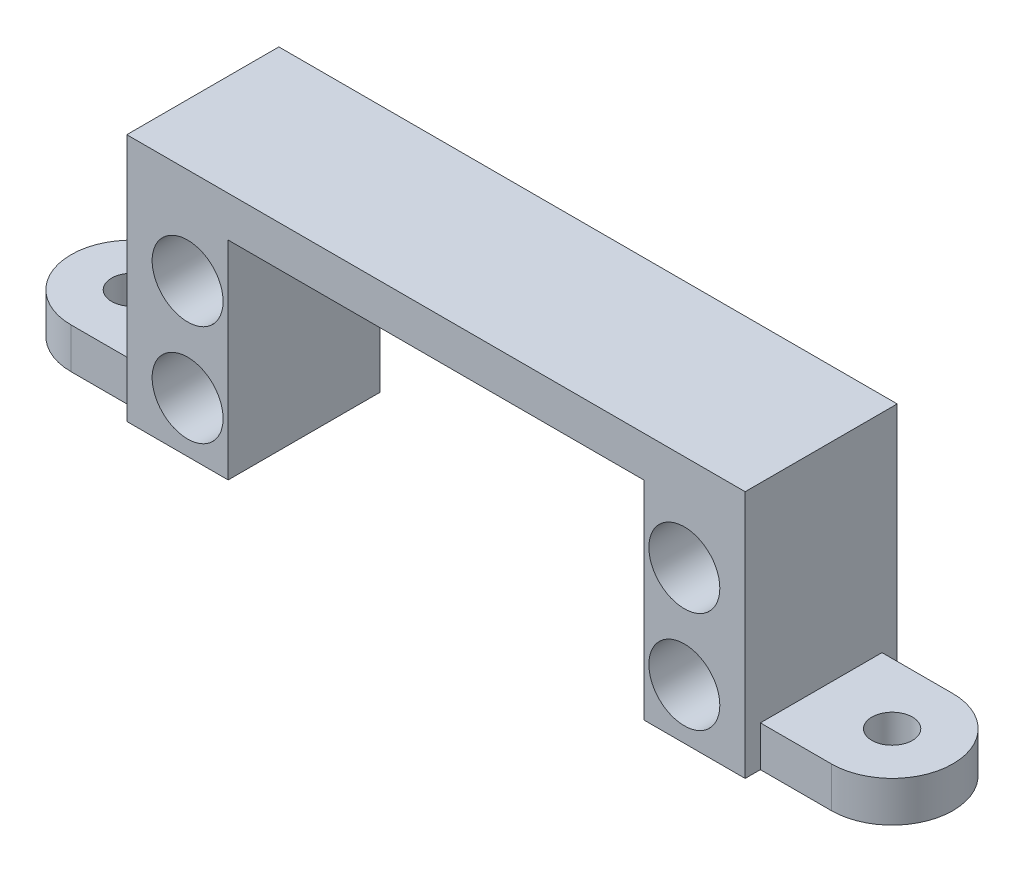
ISO-10303-21;
HEADER;
FILE_DESCRIPTION(('STEP AP214'),'2;1');
FILE_NAME('part.step','',(''),(''),'','','');
FILE_SCHEMA(('AUTOMOTIVE_DESIGN { 1 0 10303 214 1 1 1 1 }'));
ENDSEC;
DATA;
#1=APPLICATION_CONTEXT('core data for automotive mechanical design processes');
#2=APPLICATION_PROTOCOL_DEFINITION('international standard','automotive_design',2000,#1);
#3=PRODUCT_CONTEXT('',#1,'mechanical');
#4=PRODUCT('Part','Part','',(#3));
#5=PRODUCT_RELATED_PRODUCT_CATEGORY('part','',(#4));
#6=PRODUCT_DEFINITION_FORMATION('','',#4);
#7=PRODUCT_DEFINITION_CONTEXT('part definition',#1,'design');
#8=PRODUCT_DEFINITION('design','',#6,#7);
#9=PRODUCT_DEFINITION_SHAPE('','',#8);
#10=(LENGTH_UNIT() NAMED_UNIT(*) SI_UNIT(.MILLI.,.METRE.));
#11=(NAMED_UNIT(*) PLANE_ANGLE_UNIT() SI_UNIT($,.RADIAN.));
#12=(NAMED_UNIT(*) SI_UNIT($,.STERADIAN.) SOLID_ANGLE_UNIT());
#13=UNCERTAINTY_MEASURE_WITH_UNIT(LENGTH_MEASURE(1.E-05),#10,'distance_accuracy_value','');
#14=(GEOMETRIC_REPRESENTATION_CONTEXT(3) GLOBAL_UNCERTAINTY_ASSIGNED_CONTEXT((#13)) GLOBAL_UNIT_ASSIGNED_CONTEXT((#10,
#11,#12)) REPRESENTATION_CONTEXT('',''));
#15=CARTESIAN_POINT('',(0.,0.,0.));
#16=DIRECTION('',(0.,0.,1.));
#17=DIRECTION('',(1.,0.,0.));
#18=AXIS2_PLACEMENT_3D('',#15,#16,#17);
#19=CARTESIAN_POINT('',(-10.,24.5,15.));
#20=DIRECTION('',(1.,0.,0.));
#21=DIRECTION('',(0.,1.,0.));
#22=AXIS2_PLACEMENT_3D('',#19,#20,#21);
#23=PLANE('',#22);
#24=DIRECTION('',(0.,-1.,0.));
#25=VECTOR('',#24,1.);
#26=CARTESIAN_POINT('',(-10.,4.,1.5));
#27=LINE('',#26,#25);
#28=CARTESIAN_POINT('',(-10.,4.,1.5));
#29=VERTEX_POINT('',#28);
#30=CARTESIAN_POINT('',(-10.,0.,1.5));
#31=VERTEX_POINT('',#30);
#32=EDGE_CURVE('E725',#29,#31,#27,.T.);
#33=ORIENTED_EDGE('',*,*,#32,.F.);
#34=DIRECTION('',(0.,0.,-1.));
#35=VECTOR('',#34,1.);
#36=CARTESIAN_POINT('',(-10.,4.,0.));
#37=LINE('',#36,#35);
#38=CARTESIAN_POINT('',(-10.,4.,13.5));
#39=VERTEX_POINT('',#38);
#40=EDGE_CURVE('E216',#39,#29,#37,.T.);
#41=ORIENTED_EDGE('',*,*,#40,.F.);
#42=DIRECTION('',(0.,-1.,0.));
#43=VECTOR('',#42,1.);
#44=CARTESIAN_POINT('',(-10.,4.,13.5));
#45=LINE('',#44,#43);
#46=CARTESIAN_POINT('',(-10.,0.,13.5));
#47=VERTEX_POINT('',#46);
#48=EDGE_CURVE('E193',#39,#47,#45,.T.);
#49=ORIENTED_EDGE('',*,*,#48,.T.);
#50=DIRECTION('',(0.,0.,-1.));
#51=VECTOR('',#50,1.);
#52=CARTESIAN_POINT('',(-10.,0.,15.));
#53=LINE('',#52,#51);
#54=CARTESIAN_POINT('',(-10.,0.,15.));
#55=VERTEX_POINT('',#54);
#56=EDGE_CURVE('E210',#55,#47,#53,.T.);
#57=ORIENTED_EDGE('',*,*,#56,.F.);
#58=DIRECTION('',(0.,-1.,0.));
#59=VECTOR('',#58,1.);
#60=CARTESIAN_POINT('',(-10.,24.5,15.));
#61=LINE('',#60,#59);
#62=CARTESIAN_POINT('',(-10.,24.5,15.));
#63=VERTEX_POINT('',#62);
#64=EDGE_CURVE('E320',#63,#55,#61,.T.);
#65=ORIENTED_EDGE('',*,*,#64,.F.);
#66=DIRECTION('',(0.,0.,-1.));
#67=VECTOR('',#66,1.);
#68=CARTESIAN_POINT('',(-10.,24.5,15.));
#69=LINE('',#68,#67);
#70=CARTESIAN_POINT('',(-10.,24.5,0.));
#71=VERTEX_POINT('',#70);
#72=EDGE_CURVE('E340',#63,#71,#69,.T.);
#73=ORIENTED_EDGE('',*,*,#72,.T.);
#74=DIRECTION('',(0.,-1.,0.));
#75=VECTOR('',#74,1.);
#76=CARTESIAN_POINT('',(-10.,24.5,0.));
#77=LINE('',#76,#75);
#78=CARTESIAN_POINT('',(-10.,0.,0.));
#79=VERTEX_POINT('',#78);
#80=EDGE_CURVE('E308',#71,#79,#77,.T.);
#81=ORIENTED_EDGE('',*,*,#80,.T.);
#82=EDGE_CURVE('E322',#31,#79,#53,.T.);
#83=ORIENTED_EDGE('',*,*,#82,.F.);
#84=EDGE_LOOP('',(#33,#41,#49,#57,#65,#73,#81,#83));
#85=FACE_BOUND('',#84,.T.);
#86=ADVANCED_FACE('F73',(#85),#23,.F.);
#87=CARTESIAN_POINT('',(51.,0.,15.));
#88=DIRECTION('',(-1.,0.,0.));
#89=DIRECTION('',(0.,0.,1.));
#90=AXIS2_PLACEMENT_3D('',#87,#88,#89);
#91=PLANE('',#90);
#92=DIRECTION('',(0.,-1.,0.));
#93=VECTOR('',#92,1.);
#94=CARTESIAN_POINT('',(51.,4.,13.5));
#95=LINE('',#94,#93);
#96=CARTESIAN_POINT('',(51.,4.,13.5));
#97=VERTEX_POINT('',#96);
#98=CARTESIAN_POINT('',(51.,0.,13.5));
#99=VERTEX_POINT('',#98);
#100=EDGE_CURVE('E253',#97,#99,#95,.T.);
#101=ORIENTED_EDGE('',*,*,#100,.F.);
#102=DIRECTION('',(0.,0.,-1.));
#103=VECTOR('',#102,1.);
#104=CARTESIAN_POINT('',(51.,4.,0.));
#105=LINE('',#104,#103);
#106=CARTESIAN_POINT('',(51.,4.,1.50000000000002));
#107=VERTEX_POINT('',#106);
#108=EDGE_CURVE('E231',#97,#107,#105,.T.);
#109=ORIENTED_EDGE('',*,*,#108,.T.);
#110=DIRECTION('',(0.,-1.,0.));
#111=VECTOR('',#110,1.);
#112=CARTESIAN_POINT('',(51.,4.,1.50000000000002));
#113=LINE('',#112,#111);
#114=CARTESIAN_POINT('',(51.,0.,1.50000000000002));
#115=VERTEX_POINT('',#114);
#116=EDGE_CURVE('E251',#107,#115,#113,.T.);
#117=ORIENTED_EDGE('',*,*,#116,.T.);
#118=DIRECTION('',(0.,0.,-1.));
#119=VECTOR('',#118,1.);
#120=CARTESIAN_POINT('',(51.,0.,15.));
#121=LINE('',#120,#119);
#122=CARTESIAN_POINT('',(51.,0.,0.));
#123=VERTEX_POINT('',#122);
#124=EDGE_CURVE('E346',#115,#123,#121,.T.);
#125=ORIENTED_EDGE('',*,*,#124,.T.);
#126=DIRECTION('',(0.,1.,0.));
#127=VECTOR('',#126,1.);
#128=CARTESIAN_POINT('',(51.,0.,0.));
#129=LINE('',#128,#127);
#130=CARTESIAN_POINT('',(51.,24.5,0.));
#131=VERTEX_POINT('',#130);
#132=EDGE_CURVE('E333',#123,#131,#129,.T.);
#133=ORIENTED_EDGE('',*,*,#132,.T.);
#134=DIRECTION('',(0.,0.,-1.));
#135=VECTOR('',#134,1.);
#136=CARTESIAN_POINT('',(51.,24.5,15.));
#137=LINE('',#136,#135);
#138=CARTESIAN_POINT('',(51.,24.5,15.));
#139=VERTEX_POINT('',#138);
#140=EDGE_CURVE('E343',#139,#131,#137,.T.);
#141=ORIENTED_EDGE('',*,*,#140,.F.);
#142=DIRECTION('',(0.,1.,0.));
#143=VECTOR('',#142,1.);
#144=CARTESIAN_POINT('',(51.,0.,15.));
#145=LINE('',#144,#143);
#146=CARTESIAN_POINT('',(51.,0.,15.));
#147=VERTEX_POINT('',#146);
#148=EDGE_CURVE('E316',#147,#139,#145,.T.);
#149=ORIENTED_EDGE('',*,*,#148,.F.);
#150=EDGE_CURVE('E347',#147,#99,#121,.T.);
#151=ORIENTED_EDGE('',*,*,#150,.T.);
#152=EDGE_LOOP('',(#101,#109,#117,#125,#133,#141,#149,#151));
#153=FACE_BOUND('',#152,.T.);
#154=ADVANCED_FACE('F397',(#153),#91,.F.);
#155=CARTESIAN_POINT('',(-10.,0.,15.));
#156=DIRECTION('',(0.,1.,0.));
#157=DIRECTION('',(0.,0.,1.));
#158=AXIS2_PLACEMENT_3D('',#155,#156,#157);
#159=PLANE('',#158);
#160=DIRECTION('',(1.,0.,0.));
#161=VECTOR('',#160,1.);
#162=CARTESIAN_POINT('',(-10.,0.,0.));
#163=LINE('',#162,#161);
#164=CARTESIAN_POINT('',(0.,0.,0.));
#165=VERTEX_POINT('',#164);
#166=EDGE_CURVE('E303',#79,#165,#163,.T.);
#167=ORIENTED_EDGE('',*,*,#166,.T.);
#168=DIRECTION('',(0.,0.,-1.));
#169=VECTOR('',#168,1.);
#170=CARTESIAN_POINT('',(0.,0.,15.));
#171=LINE('',#170,#169);
#172=CARTESIAN_POINT('',(0.,0.,15.));
#173=VERTEX_POINT('',#172);
#174=EDGE_CURVE('E13',#173,#165,#171,.T.);
#175=ORIENTED_EDGE('',*,*,#174,.F.);
#176=DIRECTION('',(1.,0.,0.));
#177=VECTOR('',#176,1.);
#178=CARTESIAN_POINT('',(-10.,0.,15.));
#179=LINE('',#178,#177);
#180=EDGE_CURVE('E304',#55,#173,#179,.T.);
#181=ORIENTED_EDGE('',*,*,#180,.F.);
#182=ORIENTED_EDGE('',*,*,#56,.T.);
#183=DIRECTION('',(1.,0.,0.));
#184=VECTOR('',#183,1.);
#185=CARTESIAN_POINT('',(0.,0.,13.5));
#186=LINE('',#185,#184);
#187=CARTESIAN_POINT('',(-17.,0.,13.5));
#188=VERTEX_POINT('',#187);
#189=EDGE_CURVE('E88',#188,#47,#186,.T.);
#190=ORIENTED_EDGE('',*,*,#189,.F.);
#191=CARTESIAN_POINT('',(-17.,0.,7.5));
#192=DIRECTION('',(0.,-1.,0.));
#193=DIRECTION('',(0.,0.,-1.));
#194=AXIS2_PLACEMENT_3D('',#191,#192,#193);
#195=CIRCLE('',#194,6.);
#196=CARTESIAN_POINT('',(-17.,0.,1.5));
#197=VERTEX_POINT('',#196);
#198=EDGE_CURVE('E196',#188,#197,#195,.T.);
#199=ORIENTED_EDGE('',*,*,#198,.T.);
#200=DIRECTION('',(1.,0.,0.));
#201=VECTOR('',#200,1.);
#202=CARTESIAN_POINT('',(0.,0.,1.5));
#203=LINE('',#202,#201);
#204=EDGE_CURVE('E211',#197,#31,#203,.T.);
#205=ORIENTED_EDGE('',*,*,#204,.T.);
#206=ORIENTED_EDGE('',*,*,#82,.T.);
#207=EDGE_LOOP('',(#167,#175,#181,#182,#190,#199,#205,#206));
#208=FACE_BOUND('',#207,.T.);
#209=CARTESIAN_POINT('',(-17.,0.,7.5));
#210=DIRECTION('',(0.,-1.,0.));
#211=DIRECTION('',(0.,0.,-1.));
#212=AXIS2_PLACEMENT_3D('',#209,#210,#211);
#213=CIRCLE('',#212,2.);
#214=CARTESIAN_POINT('',(-17.,0.,5.5));
#215=VERTEX_POINT('',#214);
#216=EDGE_CURVE('E241',#215,#215,#213,.T.);
#217=ORIENTED_EDGE('',*,*,#216,.F.);
#218=EDGE_LOOP('',(#217));
#219=FACE_BOUND('',#218,.T.);
#220=ADVANCED_FACE('F75',(#208,#219),#159,.F.);
#221=CARTESIAN_POINT('',(0.,0.,15.));
#222=DIRECTION('',(-1.,0.,0.));
#223=DIRECTION('',(0.,0.,1.));
#224=AXIS2_PLACEMENT_3D('',#221,#222,#223);
#225=PLANE('',#224);
#226=DIRECTION('',(0.,1.,0.));
#227=VECTOR('',#226,1.);
#228=CARTESIAN_POINT('',(0.,0.,0.));
#229=LINE('',#228,#227);
#230=CARTESIAN_POINT('',(0.,20.5,0.));
#231=VERTEX_POINT('',#230);
#232=EDGE_CURVE('E324',#165,#231,#229,.T.);
#233=ORIENTED_EDGE('',*,*,#232,.T.);
#234=DIRECTION('',(0.,0.,-1.));
#235=VECTOR('',#234,1.);
#236=CARTESIAN_POINT('',(0.,20.5,15.));
#237=LINE('',#236,#235);
#238=CARTESIAN_POINT('',(0.,20.5,15.));
#239=VERTEX_POINT('',#238);
#240=EDGE_CURVE('E81',#239,#231,#237,.T.);
#241=ORIENTED_EDGE('',*,*,#240,.F.);
#242=DIRECTION('',(0.,1.,0.));
#243=VECTOR('',#242,1.);
#244=CARTESIAN_POINT('',(0.,0.,15.));
#245=LINE('',#244,#243);
#246=EDGE_CURVE('E307',#173,#239,#245,.T.);
#247=ORIENTED_EDGE('',*,*,#246,.F.);
#248=ORIENTED_EDGE('',*,*,#174,.T.);
#249=EDGE_LOOP('',(#233,#241,#247,#248));
#250=FACE_BOUND('',#249,.T.);
#251=ADVANCED_FACE('F384',(#250),#225,.F.);
#252=CARTESIAN_POINT('',(0.,20.5,15.));
#253=DIRECTION('',(0.,1.,0.));
#254=DIRECTION('',(0.,0.,1.));
#255=AXIS2_PLACEMENT_3D('',#252,#253,#254);
#256=PLANE('',#255);
#257=DIRECTION('',(1.,0.,0.));
#258=VECTOR('',#257,1.);
#259=CARTESIAN_POINT('',(0.,20.5,0.));
#260=LINE('',#259,#258);
#261=CARTESIAN_POINT('',(41.,20.5,0.));
#262=VERTEX_POINT('',#261);
#263=EDGE_CURVE('E326',#231,#262,#260,.T.);
#264=ORIENTED_EDGE('',*,*,#263,.T.);
#265=DIRECTION('',(0.,0.,-1.));
#266=VECTOR('',#265,1.);
#267=CARTESIAN_POINT('',(41.,20.5,15.));
#268=LINE('',#267,#266);
#269=CARTESIAN_POINT('',(41.,20.5,15.));
#270=VERTEX_POINT('',#269);
#271=EDGE_CURVE('E353',#270,#262,#268,.T.);
#272=ORIENTED_EDGE('',*,*,#271,.F.);
#273=DIRECTION('',(1.,0.,0.));
#274=VECTOR('',#273,1.);
#275=CARTESIAN_POINT('',(0.,20.5,15.));
#276=LINE('',#275,#274);
#277=EDGE_CURVE('E310',#239,#270,#276,.T.);
#278=ORIENTED_EDGE('',*,*,#277,.F.);
#279=ORIENTED_EDGE('',*,*,#240,.T.);
#280=EDGE_LOOP('',(#264,#272,#278,#279));
#281=FACE_BOUND('',#280,.T.);
#282=ADVANCED_FACE('F360',(#281),#256,.F.);
#283=CARTESIAN_POINT('',(41.,20.5,15.));
#284=DIRECTION('',(1.,0.,0.));
#285=DIRECTION('',(0.,1.,0.));
#286=AXIS2_PLACEMENT_3D('',#283,#284,#285);
#287=PLANE('',#286);
#288=DIRECTION('',(0.,-1.,0.));
#289=VECTOR('',#288,1.);
#290=CARTESIAN_POINT('',(41.,20.5,0.));
#291=LINE('',#290,#289);
#292=CARTESIAN_POINT('',(41.,0.,0.));
#293=VERTEX_POINT('',#292);
#294=EDGE_CURVE('E328',#262,#293,#291,.T.);
#295=ORIENTED_EDGE('',*,*,#294,.T.);
#296=DIRECTION('',(0.,0.,-1.));
#297=VECTOR('',#296,1.);
#298=CARTESIAN_POINT('',(41.,0.,15.));
#299=LINE('',#298,#297);
#300=CARTESIAN_POINT('',(41.,0.,15.));
#301=VERTEX_POINT('',#300);
#302=EDGE_CURVE('E350',#301,#293,#299,.T.);
#303=ORIENTED_EDGE('',*,*,#302,.F.);
#304=DIRECTION('',(0.,-1.,0.));
#305=VECTOR('',#304,1.);
#306=CARTESIAN_POINT('',(41.,20.5,15.));
#307=LINE('',#306,#305);
#308=EDGE_CURVE('E312',#270,#301,#307,.T.);
#309=ORIENTED_EDGE('',*,*,#308,.F.);
#310=ORIENTED_EDGE('',*,*,#271,.T.);
#311=EDGE_LOOP('',(#295,#303,#309,#310));
#312=FACE_BOUND('',#311,.T.);
#313=ADVANCED_FACE('F371',(#312),#287,.F.);
#314=CARTESIAN_POINT('',(41.,0.,15.));
#315=DIRECTION('',(0.,1.,0.));
#316=DIRECTION('',(-1.,0.,0.));
#317=AXIS2_PLACEMENT_3D('',#314,#315,#316);
#318=PLANE('',#317);
#319=DIRECTION('',(1.,0.,0.));
#320=VECTOR('',#319,1.);
#321=CARTESIAN_POINT('',(41.,0.,0.));
#322=LINE('',#321,#320);
#323=EDGE_CURVE('E330',#293,#123,#322,.T.);
#324=ORIENTED_EDGE('',*,*,#323,.T.);
#325=ORIENTED_EDGE('',*,*,#124,.F.);
#326=DIRECTION('',(-1.,0.,0.));
#327=VECTOR('',#326,1.);
#328=CARTESIAN_POINT('',(0.,0.,1.50000000000002));
#329=LINE('',#328,#327);
#330=CARTESIAN_POINT('',(58.,0.,1.50000000000002));
#331=VERTEX_POINT('',#330);
#332=EDGE_CURVE('E96',#331,#115,#329,.T.);
#333=ORIENTED_EDGE('',*,*,#332,.F.);
#334=CARTESIAN_POINT('',(58.,0.,7.5));
#335=DIRECTION('',(0.,-1.,0.));
#336=DIRECTION('',(0.,0.,-1.));
#337=AXIS2_PLACEMENT_3D('',#334,#335,#336);
#338=CIRCLE('',#337,5.99999999999998);
#339=CARTESIAN_POINT('',(58.,0.,13.5));
#340=VERTEX_POINT('',#339);
#341=EDGE_CURVE('E240',#331,#340,#338,.T.);
#342=ORIENTED_EDGE('',*,*,#341,.T.);
#343=DIRECTION('',(-1.,0.,0.));
#344=VECTOR('',#343,1.);
#345=CARTESIAN_POINT('',(0.,0.,13.5));
#346=LINE('',#345,#344);
#347=EDGE_CURVE('E244',#340,#99,#346,.T.);
#348=ORIENTED_EDGE('',*,*,#347,.T.);
#349=ORIENTED_EDGE('',*,*,#150,.F.);
#350=DIRECTION('',(1.,0.,0.));
#351=VECTOR('',#350,1.);
#352=CARTESIAN_POINT('',(41.,0.,15.));
#353=LINE('',#352,#351);
#354=EDGE_CURVE('E314',#301,#147,#353,.T.);
#355=ORIENTED_EDGE('',*,*,#354,.F.);
#356=ORIENTED_EDGE('',*,*,#302,.T.);
#357=EDGE_LOOP('',(#324,#325,#333,#342,#348,#349,#355,#356));
#358=FACE_BOUND('',#357,.T.);
#359=CARTESIAN_POINT('',(58.,0.,7.5));
#360=DIRECTION('',(0.,-1.,0.));
#361=DIRECTION('',(0.,0.,-1.));
#362=AXIS2_PLACEMENT_3D('',#359,#360,#361);
#363=CIRCLE('',#362,2.);
#364=CARTESIAN_POINT('',(58.,0.,5.5));
#365=VERTEX_POINT('',#364);
#366=EDGE_CURVE('E237',#365,#365,#363,.T.);
#367=ORIENTED_EDGE('',*,*,#366,.F.);
#368=EDGE_LOOP('',(#367));
#369=FACE_BOUND('',#368,.T.);
#370=ADVANCED_FACE('F375',(#358,#369),#318,.F.);
#371=CARTESIAN_POINT('',(51.,24.5,15.));
#372=DIRECTION('',(0.,-1.,0.));
#373=DIRECTION('',(1.,0.,0.));
#374=AXIS2_PLACEMENT_3D('',#371,#372,#373);
#375=PLANE('',#374);
#376=DIRECTION('',(-1.,0.,0.));
#377=VECTOR('',#376,1.);
#378=CARTESIAN_POINT('',(51.,24.5,0.));
#379=LINE('',#378,#377);
#380=EDGE_CURVE('E335',#131,#71,#379,.T.);
#381=ORIENTED_EDGE('',*,*,#380,.T.);
#382=ORIENTED_EDGE('',*,*,#72,.F.);
#383=DIRECTION('',(-1.,0.,0.));
#384=VECTOR('',#383,1.);
#385=CARTESIAN_POINT('',(51.,24.5,15.));
#386=LINE('',#385,#384);
#387=EDGE_CURVE('E318',#139,#63,#386,.T.);
#388=ORIENTED_EDGE('',*,*,#387,.F.);
#389=ORIENTED_EDGE('',*,*,#140,.T.);
#390=EDGE_LOOP('',(#381,#382,#388,#389));
#391=FACE_BOUND('',#390,.T.);
#392=ADVANCED_FACE('F394',(#391),#375,.F.);
#393=CARTESIAN_POINT('',(0.,0.,15.));
#394=DIRECTION('',(0.,0.,1.));
#395=DIRECTION('',(1.,0.,0.));
#396=AXIS2_PLACEMENT_3D('',#393,#394,#395);
#397=PLANE('',#396);
#398=CARTESIAN_POINT('',(45.,15.,15.));
#399=DIRECTION('',(0.,0.,1.));
#400=DIRECTION('',(1.,0.,0.));
#401=AXIS2_PLACEMENT_3D('',#398,#399,#400);
#402=CIRCLE('',#401,3.5);
#403=CARTESIAN_POINT('',(48.5,15.,15.));
#404=VERTEX_POINT('',#403);
#405=EDGE_CURVE('E286',#404,#404,#402,.T.);
#406=ORIENTED_EDGE('',*,*,#405,.F.);
#407=EDGE_LOOP('',(#406));
#408=FACE_BOUND('',#407,.T.);
#409=CARTESIAN_POINT('',(-4.,5.,15.));
#410=DIRECTION('',(0.,0.,1.));
#411=DIRECTION('',(1.,0.,0.));
#412=AXIS2_PLACEMENT_3D('',#409,#410,#411);
#413=CIRCLE('',#412,3.5);
#414=CARTESIAN_POINT('',(-0.5,5.,15.));
#415=VERTEX_POINT('',#414);
#416=EDGE_CURVE('E285',#415,#415,#413,.T.);
#417=ORIENTED_EDGE('',*,*,#416,.F.);
#418=EDGE_LOOP('',(#417));
#419=FACE_BOUND('',#418,.T.);
#420=CARTESIAN_POINT('',(-4.,15.,15.));
#421=DIRECTION('',(0.,0.,1.));
#422=DIRECTION('',(1.,0.,0.));
#423=AXIS2_PLACEMENT_3D('',#420,#421,#422);
#424=CIRCLE('',#423,3.5);
#425=CARTESIAN_POINT('',(-0.500000000000001,15.,15.));
#426=VERTEX_POINT('',#425);
#427=EDGE_CURVE('E279',#426,#426,#424,.T.);
#428=ORIENTED_EDGE('',*,*,#427,.F.);
#429=EDGE_LOOP('',(#428));
#430=FACE_BOUND('',#429,.T.);
#431=CARTESIAN_POINT('',(45.,5.,15.));
#432=DIRECTION('',(0.,0.,1.));
#433=DIRECTION('',(1.,0.,0.));
#434=AXIS2_PLACEMENT_3D('',#431,#432,#433);
#435=CIRCLE('',#434,3.5);
#436=CARTESIAN_POINT('',(48.5,5.,15.));
#437=VERTEX_POINT('',#436);
#438=EDGE_CURVE('E293',#437,#437,#435,.T.);
#439=ORIENTED_EDGE('',*,*,#438,.F.);
#440=EDGE_LOOP('',(#439));
#441=FACE_BOUND('',#440,.T.);
#442=ORIENTED_EDGE('',*,*,#180,.T.);
#443=ORIENTED_EDGE('',*,*,#246,.T.);
#444=ORIENTED_EDGE('',*,*,#277,.T.);
#445=ORIENTED_EDGE('',*,*,#308,.T.);
#446=ORIENTED_EDGE('',*,*,#354,.T.);
#447=ORIENTED_EDGE('',*,*,#148,.T.);
#448=ORIENTED_EDGE('',*,*,#387,.T.);
#449=ORIENTED_EDGE('',*,*,#64,.T.);
#450=EDGE_LOOP('',(#442,#443,#444,#445,#446,#447,#448,#449));
#451=FACE_BOUND('',#450,.T.);
#452=ADVANCED_FACE('F381',(#408,#419,#430,#441,#451),#397,.T.);
#453=CARTESIAN_POINT('',(0.,0.,0.));
#454=DIRECTION('',(0.,0.,1.));
#455=DIRECTION('',(1.,0.,0.));
#456=AXIS2_PLACEMENT_3D('',#453,#454,#455);
#457=PLANE('',#456);
#458=CARTESIAN_POINT('',(-4.,5.,0.));
#459=DIRECTION('',(0.,0.,1.));
#460=DIRECTION('',(1.,0.,0.));
#461=AXIS2_PLACEMENT_3D('',#458,#459,#460);
#462=CIRCLE('',#461,2.);
#463=CARTESIAN_POINT('',(-2.,5.,0.));
#464=VERTEX_POINT('',#463);
#465=EDGE_CURVE('E265',#464,#464,#462,.F.);
#466=ORIENTED_EDGE('',*,*,#465,.F.);
#467=EDGE_LOOP('',(#466));
#468=FACE_BOUND('',#467,.T.);
#469=CARTESIAN_POINT('',(45.,15.,0.));
#470=DIRECTION('',(0.,0.,1.));
#471=DIRECTION('',(1.,0.,0.));
#472=AXIS2_PLACEMENT_3D('',#469,#470,#471);
#473=CIRCLE('',#472,2.);
#474=CARTESIAN_POINT('',(47.,15.,0.));
#475=VERTEX_POINT('',#474);
#476=EDGE_CURVE('E266',#475,#475,#473,.F.);
#477=ORIENTED_EDGE('',*,*,#476,.F.);
#478=EDGE_LOOP('',(#477));
#479=FACE_BOUND('',#478,.T.);
#480=CARTESIAN_POINT('',(45.,5.,0.));
#481=DIRECTION('',(0.,0.,1.));
#482=DIRECTION('',(1.,0.,0.));
#483=AXIS2_PLACEMENT_3D('',#480,#481,#482);
#484=CIRCLE('',#483,2.);
#485=CARTESIAN_POINT('',(47.,5.,0.));
#486=VERTEX_POINT('',#485);
#487=EDGE_CURVE('E258',#486,#486,#484,.F.);
#488=ORIENTED_EDGE('',*,*,#487,.F.);
#489=EDGE_LOOP('',(#488));
#490=FACE_BOUND('',#489,.T.);
#491=CARTESIAN_POINT('',(-4.,15.,0.));
#492=DIRECTION('',(0.,0.,1.));
#493=DIRECTION('',(1.,0.,0.));
#494=AXIS2_PLACEMENT_3D('',#491,#492,#493);
#495=CIRCLE('',#494,2.);
#496=CARTESIAN_POINT('',(-2.,15.,0.));
#497=VERTEX_POINT('',#496);
#498=EDGE_CURVE('E276',#497,#497,#495,.F.);
#499=ORIENTED_EDGE('',*,*,#498,.F.);
#500=EDGE_LOOP('',(#499));
#501=FACE_BOUND('',#500,.T.);
#502=ORIENTED_EDGE('',*,*,#166,.F.);
#503=ORIENTED_EDGE('',*,*,#80,.F.);
#504=ORIENTED_EDGE('',*,*,#380,.F.);
#505=ORIENTED_EDGE('',*,*,#132,.F.);
#506=ORIENTED_EDGE('',*,*,#323,.F.);
#507=ORIENTED_EDGE('',*,*,#294,.F.);
#508=ORIENTED_EDGE('',*,*,#263,.F.);
#509=ORIENTED_EDGE('',*,*,#232,.F.);
#510=EDGE_LOOP('',(#502,#503,#504,#505,#506,#507,#508,#509));
#511=FACE_BOUND('',#510,.T.);
#512=ADVANCED_FACE('F366',(#468,#479,#490,#501,#511),#457,.F.);
#513=CARTESIAN_POINT('',(45.,5.,-9.89949493661167));
#514=DIRECTION('',(0.,0.,1.));
#515=DIRECTION('',(1.,0.,0.));
#516=AXIS2_PLACEMENT_3D('',#513,#514,#515);
#517=CYLINDRICAL_SURFACE('',#516,3.5);
#518=CARTESIAN_POINT('',(45.,5.,4.));
#519=DIRECTION('',(0.,0.,1.));
#520=DIRECTION('',(1.,0.,0.));
#521=AXIS2_PLACEMENT_3D('',#518,#519,#520);
#522=CIRCLE('',#521,3.5);
#523=CARTESIAN_POINT('',(48.5,5.,4.));
#524=VERTEX_POINT('',#523);
#525=EDGE_CURVE('E300',#524,#524,#522,.F.);
#526=ORIENTED_EDGE('',*,*,#525,.T.);
#527=EDGE_LOOP('',(#526));
#528=FACE_BOUND('',#527,.T.);
#529=ORIENTED_EDGE('',*,*,#438,.T.);
#530=EDGE_LOOP('',(#529));
#531=FACE_BOUND('',#530,.T.);
#532=ADVANCED_FACE('F543',(#528,#531),#517,.F.);
#533=CARTESIAN_POINT('',(0.,0.,4.));
#534=DIRECTION('',(0.,0.,1.));
#535=DIRECTION('',(1.,0.,0.));
#536=AXIS2_PLACEMENT_3D('',#533,#534,#535);
#537=PLANE('',#536);
#538=CARTESIAN_POINT('',(45.,5.,4.));
#539=DIRECTION('',(0.,0.,1.));
#540=DIRECTION('',(1.,0.,0.));
#541=AXIS2_PLACEMENT_3D('',#538,#539,#540);
#542=CIRCLE('',#541,2.);
#543=CARTESIAN_POINT('',(47.,5.,4.));
#544=VERTEX_POINT('',#543);
#545=EDGE_CURVE('E250',#544,#544,#542,.T.);
#546=ORIENTED_EDGE('',*,*,#545,.F.);
#547=EDGE_LOOP('',(#546));
#548=FACE_BOUND('',#547,.T.);
#549=ORIENTED_EDGE('',*,*,#525,.F.);
#550=EDGE_LOOP('',(#549));
#551=FACE_BOUND('',#550,.T.);
#552=ADVANCED_FACE('F538',(#548,#551),#537,.T.);
#553=CARTESIAN_POINT('',(-4.,15.,-9.89949493661167));
#554=DIRECTION('',(0.,0.,1.));
#555=DIRECTION('',(1.,0.,0.));
#556=AXIS2_PLACEMENT_3D('',#553,#554,#555);
#557=CYLINDRICAL_SURFACE('',#556,3.5);
#558=CARTESIAN_POINT('',(-4.,15.,4.));
#559=DIRECTION('',(0.,0.,1.));
#560=DIRECTION('',(1.,0.,0.));
#561=AXIS2_PLACEMENT_3D('',#558,#559,#560);
#562=CIRCLE('',#561,3.5);
#563=CARTESIAN_POINT('',(-0.500000000000001,15.,4.));
#564=VERTEX_POINT('',#563);
#565=EDGE_CURVE('E282',#564,#564,#562,.F.);
#566=ORIENTED_EDGE('',*,*,#565,.T.);
#567=EDGE_LOOP('',(#566));
#568=FACE_BOUND('',#567,.T.);
#569=ORIENTED_EDGE('',*,*,#427,.T.);
#570=EDGE_LOOP('',(#569));
#571=FACE_BOUND('',#570,.T.);
#572=ADVANCED_FACE('F530',(#568,#571),#557,.F.);
#573=CARTESIAN_POINT('',(0.,0.,4.));
#574=DIRECTION('',(0.,0.,1.));
#575=DIRECTION('',(1.,0.,0.));
#576=AXIS2_PLACEMENT_3D('',#573,#574,#575);
#577=PLANE('',#576);
#578=CARTESIAN_POINT('',(-4.,15.,4.));
#579=DIRECTION('',(0.,0.,1.));
#580=DIRECTION('',(1.,0.,0.));
#581=AXIS2_PLACEMENT_3D('',#578,#579,#580);
#582=CIRCLE('',#581,2.);
#583=CARTESIAN_POINT('',(-2.,15.,4.));
#584=VERTEX_POINT('',#583);
#585=EDGE_CURVE('E269',#584,#584,#582,.T.);
#586=ORIENTED_EDGE('',*,*,#585,.F.);
#587=EDGE_LOOP('',(#586));
#588=FACE_BOUND('',#587,.T.);
#589=ORIENTED_EDGE('',*,*,#565,.F.);
#590=EDGE_LOOP('',(#589));
#591=FACE_BOUND('',#590,.T.);
#592=ADVANCED_FACE('F525',(#588,#591),#577,.T.);
#593=CARTESIAN_POINT('',(-4.,5.,-9.89949493661167));
#594=DIRECTION('',(0.,0.,1.));
#595=DIRECTION('',(1.,0.,0.));
#596=AXIS2_PLACEMENT_3D('',#593,#594,#595);
#597=CYLINDRICAL_SURFACE('',#596,3.5);
#598=CARTESIAN_POINT('',(-4.,5.,4.));
#599=DIRECTION('',(0.,0.,1.));
#600=DIRECTION('',(1.,0.,0.));
#601=AXIS2_PLACEMENT_3D('',#598,#599,#600);
#602=CIRCLE('',#601,3.5);
#603=CARTESIAN_POINT('',(-0.5,5.,4.));
#604=VERTEX_POINT('',#603);
#605=EDGE_CURVE('E290',#604,#604,#602,.F.);
#606=ORIENTED_EDGE('',*,*,#605,.T.);
#607=EDGE_LOOP('',(#606));
#608=FACE_BOUND('',#607,.T.);
#609=ORIENTED_EDGE('',*,*,#416,.T.);
#610=EDGE_LOOP('',(#609));
#611=FACE_BOUND('',#610,.T.);
#612=ADVANCED_FACE('F517',(#608,#611),#597,.F.);
#613=CARTESIAN_POINT('',(0.,0.,4.));
#614=DIRECTION('',(0.,0.,1.));
#615=DIRECTION('',(1.,0.,0.));
#616=AXIS2_PLACEMENT_3D('',#613,#614,#615);
#617=PLANE('',#616);
#618=CARTESIAN_POINT('',(-4.,5.,4.));
#619=DIRECTION('',(0.,0.,1.));
#620=DIRECTION('',(1.,0.,0.));
#621=AXIS2_PLACEMENT_3D('',#618,#619,#620);
#622=CIRCLE('',#621,2.);
#623=CARTESIAN_POINT('',(-2.,5.,4.));
#624=VERTEX_POINT('',#623);
#625=EDGE_CURVE('E262',#624,#624,#622,.T.);
#626=ORIENTED_EDGE('',*,*,#625,.F.);
#627=EDGE_LOOP('',(#626));
#628=FACE_BOUND('',#627,.T.);
#629=ORIENTED_EDGE('',*,*,#605,.F.);
#630=EDGE_LOOP('',(#629));
#631=FACE_BOUND('',#630,.T.);
#632=ADVANCED_FACE('F512',(#628,#631),#617,.T.);
#633=CARTESIAN_POINT('',(45.,15.,-9.89949493661167));
#634=DIRECTION('',(0.,0.,1.));
#635=DIRECTION('',(1.,0.,0.));
#636=AXIS2_PLACEMENT_3D('',#633,#634,#635);
#637=CYLINDRICAL_SURFACE('',#636,3.5);
#638=CARTESIAN_POINT('',(45.,15.,4.));
#639=DIRECTION('',(0.,0.,1.));
#640=DIRECTION('',(1.,0.,0.));
#641=AXIS2_PLACEMENT_3D('',#638,#639,#640);
#642=CIRCLE('',#641,3.5);
#643=CARTESIAN_POINT('',(48.5,15.,4.));
#644=VERTEX_POINT('',#643);
#645=EDGE_CURVE('E289',#644,#644,#642,.F.);
#646=ORIENTED_EDGE('',*,*,#645,.T.);
#647=EDGE_LOOP('',(#646));
#648=FACE_BOUND('',#647,.T.);
#649=ORIENTED_EDGE('',*,*,#405,.T.);
#650=EDGE_LOOP('',(#649));
#651=FACE_BOUND('',#650,.T.);
#652=ADVANCED_FACE('F504',(#648,#651),#637,.F.);
#653=CARTESIAN_POINT('',(0.,0.,4.));
#654=DIRECTION('',(0.,0.,1.));
#655=DIRECTION('',(1.,0.,0.));
#656=AXIS2_PLACEMENT_3D('',#653,#654,#655);
#657=PLANE('',#656);
#658=CARTESIAN_POINT('',(45.,15.,4.));
#659=DIRECTION('',(0.,0.,1.));
#660=DIRECTION('',(1.,0.,0.));
#661=AXIS2_PLACEMENT_3D('',#658,#659,#660);
#662=CIRCLE('',#661,2.);
#663=CARTESIAN_POINT('',(47.,15.,4.));
#664=VERTEX_POINT('',#663);
#665=EDGE_CURVE('E261',#664,#664,#662,.T.);
#666=ORIENTED_EDGE('',*,*,#665,.F.);
#667=EDGE_LOOP('',(#666));
#668=FACE_BOUND('',#667,.T.);
#669=ORIENTED_EDGE('',*,*,#645,.F.);
#670=EDGE_LOOP('',(#669));
#671=FACE_BOUND('',#670,.T.);
#672=ADVANCED_FACE('F494',(#668,#671),#657,.T.);
#673=CARTESIAN_POINT('',(-4.,15.,-0.00100000000000013));
#674=DIRECTION('',(0.,0.,1.));
#675=DIRECTION('',(1.,0.,0.));
#676=AXIS2_PLACEMENT_3D('',#673,#674,#675);
#677=CYLINDRICAL_SURFACE('',#676,2.);
#678=ORIENTED_EDGE('',*,*,#585,.T.);
#679=EDGE_LOOP('',(#678));
#680=FACE_BOUND('',#679,.T.);
#681=ORIENTED_EDGE('',*,*,#498,.T.);
#682=EDGE_LOOP('',(#681));
#683=FACE_BOUND('',#682,.T.);
#684=ADVANCED_FACE('F484',(#680,#683),#677,.F.);
#685=CARTESIAN_POINT('',(45.,5.,-0.00100000000000013));
#686=DIRECTION('',(0.,0.,1.));
#687=DIRECTION('',(1.,0.,0.));
#688=AXIS2_PLACEMENT_3D('',#685,#686,#687);
#689=CYLINDRICAL_SURFACE('',#688,2.);
#690=ORIENTED_EDGE('',*,*,#545,.T.);
#691=EDGE_LOOP('',(#690));
#692=FACE_BOUND('',#691,.T.);
#693=ORIENTED_EDGE('',*,*,#487,.T.);
#694=EDGE_LOOP('',(#693));
#695=FACE_BOUND('',#694,.T.);
#696=ADVANCED_FACE('F474',(#692,#695),#689,.F.);
#697=CARTESIAN_POINT('',(45.,15.,-0.00100000000000013));
#698=DIRECTION('',(0.,0.,1.));
#699=DIRECTION('',(1.,0.,0.));
#700=AXIS2_PLACEMENT_3D('',#697,#698,#699);
#701=CYLINDRICAL_SURFACE('',#700,2.);
#702=ORIENTED_EDGE('',*,*,#665,.T.);
#703=EDGE_LOOP('',(#702));
#704=FACE_BOUND('',#703,.T.);
#705=ORIENTED_EDGE('',*,*,#476,.T.);
#706=EDGE_LOOP('',(#705));
#707=FACE_BOUND('',#706,.T.);
#708=ADVANCED_FACE('F464',(#704,#707),#701,.F.);
#709=CARTESIAN_POINT('',(-4.,5.,-0.00100000000000013));
#710=DIRECTION('',(0.,0.,1.));
#711=DIRECTION('',(1.,0.,0.));
#712=AXIS2_PLACEMENT_3D('',#709,#710,#711);
#713=CYLINDRICAL_SURFACE('',#712,2.);
#714=ORIENTED_EDGE('',*,*,#625,.T.);
#715=EDGE_LOOP('',(#714));
#716=FACE_BOUND('',#715,.T.);
#717=ORIENTED_EDGE('',*,*,#465,.T.);
#718=EDGE_LOOP('',(#717));
#719=FACE_BOUND('',#718,.T.);
#720=ADVANCED_FACE('F419',(#716,#719),#713,.F.);
#721=CARTESIAN_POINT('',(58.,4.,7.5));
#722=DIRECTION('',(0.,-1.,0.));
#723=DIRECTION('',(0.,0.,-1.));
#724=AXIS2_PLACEMENT_3D('',#721,#722,#723);
#725=CYLINDRICAL_SURFACE('',#724,5.99999999999998);
#726=ORIENTED_EDGE('',*,*,#341,.F.);
#727=DIRECTION('',(0.,-1.,0.));
#728=VECTOR('',#727,1.);
#729=CARTESIAN_POINT('',(58.,4.,1.50000000000002));
#730=LINE('',#729,#728);
#731=CARTESIAN_POINT('',(58.,4.,1.50000000000002));
#732=VERTEX_POINT('',#731);
#733=EDGE_CURVE('E248',#732,#331,#730,.T.);
#734=ORIENTED_EDGE('',*,*,#733,.F.);
#735=CARTESIAN_POINT('',(58.,4.,7.5));
#736=DIRECTION('',(0.,-1.,0.));
#737=DIRECTION('',(0.,0.,-1.));
#738=AXIS2_PLACEMENT_3D('',#735,#736,#737);
#739=CIRCLE('',#738,5.99999999999998);
#740=CARTESIAN_POINT('',(58.,4.,13.5));
#741=VERTEX_POINT('',#740);
#742=EDGE_CURVE('E225',#732,#741,#739,.T.);
#743=ORIENTED_EDGE('',*,*,#742,.T.);
#744=DIRECTION('',(0.,-1.,0.));
#745=VECTOR('',#744,1.);
#746=CARTESIAN_POINT('',(58.,4.,13.5));
#747=LINE('',#746,#745);
#748=EDGE_CURVE('E236',#741,#340,#747,.T.);
#749=ORIENTED_EDGE('',*,*,#748,.T.);
#750=EDGE_LOOP('',(#726,#734,#743,#749));
#751=FACE_BOUND('',#750,.T.);
#752=ADVANCED_FACE('F400',(#751),#725,.T.);
#753=CARTESIAN_POINT('',(0.,4.,1.50000000000002));
#754=DIRECTION('',(0.,0.,1.));
#755=DIRECTION('',(1.,0.,0.));
#756=AXIS2_PLACEMENT_3D('',#753,#754,#755);
#757=PLANE('',#756);
#758=ORIENTED_EDGE('',*,*,#332,.T.);
#759=ORIENTED_EDGE('',*,*,#116,.F.);
#760=DIRECTION('',(-1.,0.,0.));
#761=VECTOR('',#760,1.);
#762=CARTESIAN_POINT('',(0.,4.,1.50000000000002));
#763=LINE('',#762,#761);
#764=EDGE_CURVE('E234',#732,#107,#763,.T.);
#765=ORIENTED_EDGE('',*,*,#764,.F.);
#766=ORIENTED_EDGE('',*,*,#733,.T.);
#767=EDGE_LOOP('',(#758,#759,#765,#766));
#768=FACE_BOUND('',#767,.T.);
#769=ADVANCED_FACE('F409',(#768),#757,.F.);
#770=CARTESIAN_POINT('',(58.,4.,7.5));
#771=DIRECTION('',(0.,-1.,0.));
#772=DIRECTION('',(0.,0.,-1.));
#773=AXIS2_PLACEMENT_3D('',#770,#771,#772);
#774=CYLINDRICAL_SURFACE('',#773,2.);
#775=CARTESIAN_POINT('',(58.,4.,7.5));
#776=DIRECTION('',(0.,-1.,0.));
#777=DIRECTION('',(0.,0.,-1.));
#778=AXIS2_PLACEMENT_3D('',#775,#776,#777);
#779=CIRCLE('',#778,2.);
#780=CARTESIAN_POINT('',(58.,4.,5.5));
#781=VERTEX_POINT('',#780);
#782=EDGE_CURVE('E222',#781,#781,#779,.T.);
#783=ORIENTED_EDGE('',*,*,#782,.F.);
#784=EDGE_LOOP('',(#783));
#785=FACE_BOUND('',#784,.T.);
#786=ORIENTED_EDGE('',*,*,#366,.T.);
#787=EDGE_LOOP('',(#786));
#788=FACE_BOUND('',#787,.T.);
#789=ADVANCED_FACE('F411',(#785,#788),#774,.F.);
#790=CARTESIAN_POINT('',(0.,4.,13.5));
#791=DIRECTION('',(0.,0.,1.));
#792=DIRECTION('',(1.,0.,0.));
#793=AXIS2_PLACEMENT_3D('',#790,#791,#792);
#794=PLANE('',#793);
#795=ORIENTED_EDGE('',*,*,#347,.F.);
#796=ORIENTED_EDGE('',*,*,#748,.F.);
#797=DIRECTION('',(-1.,0.,0.));
#798=VECTOR('',#797,1.);
#799=CARTESIAN_POINT('',(0.,4.,13.5));
#800=LINE('',#799,#798);
#801=EDGE_CURVE('E228',#741,#97,#800,.T.);
#802=ORIENTED_EDGE('',*,*,#801,.T.);
#803=ORIENTED_EDGE('',*,*,#100,.T.);
#804=EDGE_LOOP('',(#795,#796,#802,#803));
#805=FACE_BOUND('',#804,.T.);
#806=ADVANCED_FACE('F406',(#805),#794,.T.);
#807=CARTESIAN_POINT('',(0.,4.,0.));
#808=DIRECTION('',(0.,-1.,0.));
#809=DIRECTION('',(0.,0.,-1.));
#810=AXIS2_PLACEMENT_3D('',#807,#808,#809);
#811=PLANE('',#810);
#812=ORIENTED_EDGE('',*,*,#782,.T.);
#813=EDGE_LOOP('',(#812));
#814=FACE_BOUND('',#813,.T.);
#815=ORIENTED_EDGE('',*,*,#742,.F.);
#816=ORIENTED_EDGE('',*,*,#764,.T.);
#817=ORIENTED_EDGE('',*,*,#108,.F.);
#818=ORIENTED_EDGE('',*,*,#801,.F.);
#819=EDGE_LOOP('',(#815,#816,#817,#818));
#820=FACE_BOUND('',#819,.T.);
#821=ADVANCED_FACE('F408',(#814,#820),#811,.F.);
#822=CARTESIAN_POINT('',(0.,4.,13.5));
#823=DIRECTION('',(0.,0.,-1.));
#824=DIRECTION('',(-1.,0.,0.));
#825=AXIS2_PLACEMENT_3D('',#822,#823,#824);
#826=PLANE('',#825);
#827=ORIENTED_EDGE('',*,*,#189,.T.);
#828=ORIENTED_EDGE('',*,*,#48,.F.);
#829=DIRECTION('',(1.,0.,0.));
#830=VECTOR('',#829,1.);
#831=CARTESIAN_POINT('',(0.,4.,13.5));
#832=LINE('',#831,#830);
#833=CARTESIAN_POINT('',(-17.,4.,13.5));
#834=VERTEX_POINT('',#833);
#835=EDGE_CURVE('E189',#834,#39,#832,.T.);
#836=ORIENTED_EDGE('',*,*,#835,.F.);
#837=DIRECTION('',(0.,-1.,0.));
#838=VECTOR('',#837,1.);
#839=CARTESIAN_POINT('',(-17.,4.,13.5));
#840=LINE('',#839,#838);
#841=EDGE_CURVE('E186',#834,#188,#840,.T.);
#842=ORIENTED_EDGE('',*,*,#841,.T.);
#843=EDGE_LOOP('',(#827,#828,#836,#842));
#844=FACE_BOUND('',#843,.T.);
#845=ADVANCED_FACE('F188',(#844),#826,.F.);
#846=CARTESIAN_POINT('',(0.,4.,1.5));
#847=DIRECTION('',(0.,0.,-1.));
#848=DIRECTION('',(-1.,0.,0.));
#849=AXIS2_PLACEMENT_3D('',#846,#847,#848);
#850=PLANE('',#849);
#851=ORIENTED_EDGE('',*,*,#204,.F.);
#852=DIRECTION('',(0.,-1.,0.));
#853=VECTOR('',#852,1.);
#854=CARTESIAN_POINT('',(-17.,4.,1.5));
#855=LINE('',#854,#853);
#856=CARTESIAN_POINT('',(-17.,4.,1.5));
#857=VERTEX_POINT('',#856);
#858=EDGE_CURVE('E198',#857,#197,#855,.T.);
#859=ORIENTED_EDGE('',*,*,#858,.F.);
#860=DIRECTION('',(1.,0.,0.));
#861=VECTOR('',#860,1.);
#862=CARTESIAN_POINT('',(0.,4.,1.5));
#863=LINE('',#862,#861);
#864=EDGE_CURVE('E212',#857,#29,#863,.T.);
#865=ORIENTED_EDGE('',*,*,#864,.T.);
#866=ORIENTED_EDGE('',*,*,#32,.T.);
#867=EDGE_LOOP('',(#851,#859,#865,#866));
#868=FACE_BOUND('',#867,.T.);
#869=ADVANCED_FACE('F669',(#868),#850,.T.);
#870=CARTESIAN_POINT('',(0.,4.,0.));
#871=DIRECTION('',(0.,-1.,0.));
#872=DIRECTION('',(0.,0.,-1.));
#873=AXIS2_PLACEMENT_3D('',#870,#871,#872);
#874=PLANE('',#873);
#875=ORIENTED_EDGE('',*,*,#864,.F.);
#876=CARTESIAN_POINT('',(-17.,4.,7.5));
#877=DIRECTION('',(0.,-1.,0.));
#878=DIRECTION('',(0.,0.,-1.));
#879=AXIS2_PLACEMENT_3D('',#876,#877,#878);
#880=CIRCLE('',#879,6.);
#881=EDGE_CURVE('E203',#834,#857,#880,.T.);
#882=ORIENTED_EDGE('',*,*,#881,.F.);
#883=ORIENTED_EDGE('',*,*,#835,.T.);
#884=ORIENTED_EDGE('',*,*,#40,.T.);
#885=EDGE_LOOP('',(#875,#882,#883,#884));
#886=FACE_BOUND('',#885,.T.);
#887=CARTESIAN_POINT('',(-17.,4.,7.5));
#888=DIRECTION('',(0.,-1.,0.));
#889=DIRECTION('',(0.,0.,-1.));
#890=AXIS2_PLACEMENT_3D('',#887,#888,#889);
#891=CIRCLE('',#890,2.);
#892=CARTESIAN_POINT('',(-17.,4.,5.5));
#893=VERTEX_POINT('',#892);
#894=EDGE_CURVE('E202',#893,#893,#891,.T.);
#895=ORIENTED_EDGE('',*,*,#894,.T.);
#896=EDGE_LOOP('',(#895));
#897=FACE_BOUND('',#896,.T.);
#898=ADVANCED_FACE('F678',(#886,#897),#874,.F.);
#899=CARTESIAN_POINT('',(-17.,4.,7.5));
#900=DIRECTION('',(0.,-1.,0.));
#901=DIRECTION('',(0.,0.,-1.));
#902=AXIS2_PLACEMENT_3D('',#899,#900,#901);
#903=CYLINDRICAL_SURFACE('',#902,6.);
#904=ORIENTED_EDGE('',*,*,#841,.F.);
#905=ORIENTED_EDGE('',*,*,#881,.T.);
#906=ORIENTED_EDGE('',*,*,#858,.T.);
#907=ORIENTED_EDGE('',*,*,#198,.F.);
#908=EDGE_LOOP('',(#904,#905,#906,#907));
#909=FACE_BOUND('',#908,.T.);
#910=ADVANCED_FACE('F197',(#909),#903,.T.);
#911=CARTESIAN_POINT('',(-17.,4.,7.5));
#912=DIRECTION('',(0.,-1.,0.));
#913=DIRECTION('',(0.,0.,-1.));
#914=AXIS2_PLACEMENT_3D('',#911,#912,#913);
#915=CYLINDRICAL_SURFACE('',#914,2.);
#916=ORIENTED_EDGE('',*,*,#894,.F.);
#917=EDGE_LOOP('',(#916));
#918=FACE_BOUND('',#917,.T.);
#919=ORIENTED_EDGE('',*,*,#216,.T.);
#920=EDGE_LOOP('',(#919));
#921=FACE_BOUND('',#920,.T.);
#922=ADVANCED_FACE('F671',(#918,#921),#915,.F.);
#923=CLOSED_SHELL('',(#86,#154,#220,#251,#282,#313,#370,#392,#452,#512,#532,#552,#572,#592,#612,
#632,#652,#672,#684,#696,#708,#720,#752,#769,#789,#806,#821,#845,#869,#898,#910,#922));
#924=MANIFOLD_SOLID_BREP('B2',#923);
#925=ADVANCED_BREP_SHAPE_REPRESENTATION('',(#18,#924),#14);
#926=SHAPE_DEFINITION_REPRESENTATION(#9,#925);
ENDSEC;
END-ISO-10303-21;
